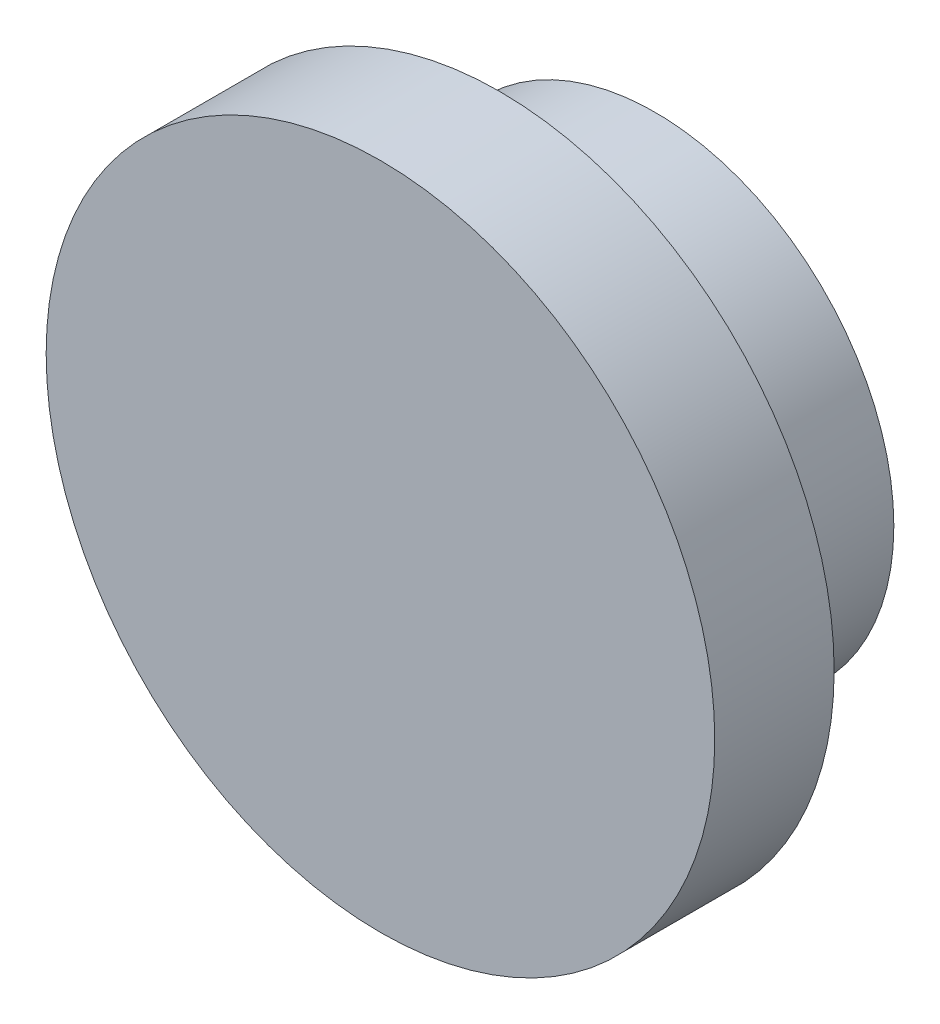
ISO-10303-21;
HEADER;
FILE_DESCRIPTION(('STEP AP214'),'2;1');
FILE_NAME('part.step','',(''),(''),'','','');
FILE_SCHEMA(('AUTOMOTIVE_DESIGN { 1 0 10303 214 1 1 1 1 }'));
ENDSEC;
DATA;
#1=APPLICATION_CONTEXT('core data for automotive mechanical design processes');
#2=APPLICATION_PROTOCOL_DEFINITION('international standard','automotive_design',2000,#1);
#3=PRODUCT_CONTEXT('',#1,'mechanical');
#4=PRODUCT('Part','Part','',(#3));
#5=PRODUCT_RELATED_PRODUCT_CATEGORY('part','',(#4));
#6=PRODUCT_DEFINITION_FORMATION('','',#4);
#7=PRODUCT_DEFINITION_CONTEXT('part definition',#1,'design');
#8=PRODUCT_DEFINITION('design','',#6,#7);
#9=PRODUCT_DEFINITION_SHAPE('','',#8);
#10=(LENGTH_UNIT() NAMED_UNIT(*) SI_UNIT(.MILLI.,.METRE.));
#11=(NAMED_UNIT(*) PLANE_ANGLE_UNIT() SI_UNIT($,.RADIAN.));
#12=(NAMED_UNIT(*) SI_UNIT($,.STERADIAN.) SOLID_ANGLE_UNIT());
#13=UNCERTAINTY_MEASURE_WITH_UNIT(LENGTH_MEASURE(1.E-05),#10,'distance_accuracy_value','');
#14=(GEOMETRIC_REPRESENTATION_CONTEXT(3) GLOBAL_UNCERTAINTY_ASSIGNED_CONTEXT((#13)) GLOBAL_UNIT_ASSIGNED_CONTEXT((#10,
#11,#12)) REPRESENTATION_CONTEXT('',''));
#15=CARTESIAN_POINT('',(0.,0.,0.));
#16=DIRECTION('',(0.,0.,1.));
#17=DIRECTION('',(1.,0.,0.));
#18=AXIS2_PLACEMENT_3D('',#15,#16,#17);
#19=CARTESIAN_POINT('',(0.,0.,6.5));
#20=DIRECTION('',(0.,0.,-1.));
#21=DIRECTION('',(-1.,0.,0.));
#22=AXIS2_PLACEMENT_3D('',#19,#20,#21);
#23=CYLINDRICAL_SURFACE('',#22,10.);
#24=CARTESIAN_POINT('',(0.,0.,6.5));
#25=DIRECTION('',(0.,0.,1.));
#26=DIRECTION('',(1.,0.,0.));
#27=AXIS2_PLACEMENT_3D('',#24,#25,#26);
#28=CIRCLE('',#27,10.);
#29=CARTESIAN_POINT('',(-10.,0.,6.5));
#30=VERTEX_POINT('',#29);
#31=EDGE_CURVE('E10',#30,#30,#28,.T.);
#32=CARTESIAN_POINT('',(0.,0.,0.));
#33=DIRECTION('',(0.,0.,1.));
#34=DIRECTION('',(1.,0.,0.));
#35=AXIS2_PLACEMENT_3D('',#32,#33,#34);
#36=CIRCLE('',#35,10.);
#37=CARTESIAN_POINT('',(-10.,0.,0.));
#38=VERTEX_POINT('',#37);
#39=EDGE_CURVE('E44',#38,#38,#36,.T.);
#40=CARTESIAN_POINT('',(-10.,0.,6.5));
#41=CARTESIAN_POINT('',(-10.,0.,6.43229166666667));
#42=CARTESIAN_POINT('',(-10.,0.,6.36458333333333));
#43=CARTESIAN_POINT('',(-10.,0.,6.22916666666667));
#44=CARTESIAN_POINT('',(-10.,0.,6.16145833333333));
#45=CARTESIAN_POINT('',(-10.,0.,6.02604166666667));
#46=CARTESIAN_POINT('',(-10.,0.,5.95833333333333));
#47=CARTESIAN_POINT('',(-10.,0.,5.82291666666667));
#48=CARTESIAN_POINT('',(-10.,0.,5.75520833333333));
#49=CARTESIAN_POINT('',(-10.,0.,5.61979166666667));
#50=CARTESIAN_POINT('',(-10.,0.,5.55208333333333));
#51=CARTESIAN_POINT('',(-10.,0.,5.41666666666667));
#52=CARTESIAN_POINT('',(-10.,0.,5.34895833333333));
#53=CARTESIAN_POINT('',(-10.,0.,5.21354166666667));
#54=CARTESIAN_POINT('',(-10.,0.,5.14583333333333));
#55=CARTESIAN_POINT('',(-10.,0.,5.01041666666667));
#56=CARTESIAN_POINT('',(-10.,0.,4.94270833333333));
#57=CARTESIAN_POINT('',(-10.,0.,4.80729166666667));
#58=CARTESIAN_POINT('',(-10.,0.,4.73958333333333));
#59=CARTESIAN_POINT('',(-10.,0.,4.60416666666667));
#60=CARTESIAN_POINT('',(-10.,0.,4.53645833333333));
#61=CARTESIAN_POINT('',(-10.,0.,4.40104166666667));
#62=CARTESIAN_POINT('',(-10.,0.,4.33333333333333));
#63=CARTESIAN_POINT('',(-10.,0.,4.19791666666667));
#64=CARTESIAN_POINT('',(-10.,0.,4.13020833333333));
#65=CARTESIAN_POINT('',(-10.,0.,3.99479166666667));
#66=CARTESIAN_POINT('',(-10.,0.,3.92708333333333));
#67=CARTESIAN_POINT('',(-10.,0.,3.79166666666667));
#68=CARTESIAN_POINT('',(-10.,0.,3.72395833333333));
#69=CARTESIAN_POINT('',(-10.,0.,3.58854166666667));
#70=CARTESIAN_POINT('',(-10.,0.,3.52083333333333));
#71=CARTESIAN_POINT('',(-10.,0.,3.38541666666667));
#72=CARTESIAN_POINT('',(-10.,0.,3.31770833333333));
#73=CARTESIAN_POINT('',(-10.,0.,3.18229166666667));
#74=CARTESIAN_POINT('',(-10.,0.,3.11458333333333));
#75=CARTESIAN_POINT('',(-10.,0.,2.97916666666667));
#76=CARTESIAN_POINT('',(-10.,0.,2.91145833333333));
#77=CARTESIAN_POINT('',(-10.,0.,2.77604166666667));
#78=CARTESIAN_POINT('',(-10.,0.,2.70833333333333));
#79=CARTESIAN_POINT('',(-10.,0.,2.57291666666667));
#80=CARTESIAN_POINT('',(-10.,0.,2.50520833333333));
#81=CARTESIAN_POINT('',(-10.,0.,2.36979166666667));
#82=CARTESIAN_POINT('',(-10.,0.,2.30208333333333));
#83=CARTESIAN_POINT('',(-10.,0.,2.16666666666667));
#84=CARTESIAN_POINT('',(-10.,0.,2.09895833333333));
#85=CARTESIAN_POINT('',(-10.,0.,1.96354166666667));
#86=CARTESIAN_POINT('',(-10.,0.,1.89583333333333));
#87=CARTESIAN_POINT('',(-10.,0.,1.76041666666667));
#88=CARTESIAN_POINT('',(-10.,0.,1.69270833333333));
#89=CARTESIAN_POINT('',(-10.,0.,1.55729166666667));
#90=CARTESIAN_POINT('',(-10.,0.,1.48958333333333));
#91=CARTESIAN_POINT('',(-10.,0.,1.35416666666667));
#92=CARTESIAN_POINT('',(-10.,0.,1.28645833333333));
#93=CARTESIAN_POINT('',(-10.,0.,1.15104166666667));
#94=CARTESIAN_POINT('',(-10.,0.,1.08333333333333));
#95=CARTESIAN_POINT('',(-10.,0.,0.947916666666667));
#96=CARTESIAN_POINT('',(-10.,0.,0.880208333333333));
#97=CARTESIAN_POINT('',(-10.,0.,0.744791666666667));
#98=CARTESIAN_POINT('',(-10.,0.,0.677083333333333));
#99=CARTESIAN_POINT('',(-10.,0.,0.541666666666667));
#100=CARTESIAN_POINT('',(-10.,0.,0.473958333333333));
#101=CARTESIAN_POINT('',(-10.,0.,0.338541666666667));
#102=CARTESIAN_POINT('',(-10.,0.,0.270833333333334));
#103=CARTESIAN_POINT('',(-10.,0.,0.135416666666667));
#104=CARTESIAN_POINT('',(-10.,0.,0.0677083333333334));
#105=CARTESIAN_POINT('',(-10.,0.,0.));
#106=B_SPLINE_CURVE_WITH_KNOTS('',3,(#40,#41,#42,#43,#44,#45,#46,#47,#48,#49,#50,#51,#52,#53,
#54,#55,#56,#57,#58,#59,#60,#61,#62,#63,#64,#65,#66,#67,#68,#69,#70,#71,#72,#73,#74,#75,#76,#77,
#78,#79,#80,#81,#82,#83,#84,#85,#86,#87,#88,#89,#90,#91,#92,#93,#94,#95,#96,#97,#98,#99,#100,
#101,#102,#103,#104,#105),.UNSPECIFIED.,.F.,.F.,(4,2,2,2,2,2,2,2,2,2,2,2,2,2,2,2,2,2,2,2,2,2,2,
2,2,2,2,2,2,2,2,2,4),(0.,0.203125,0.40625,0.609375000000001,0.812500000000001,1.015625,1.21875,
1.421875,1.625,1.828125,2.03125,2.234375,2.4375,2.640625,2.84375,3.046875,3.25,3.453125,3.65625,
3.859375,4.0625,4.265625,4.46875,4.671875,4.875,5.078125,5.28125,5.484375,5.6875,5.890625,
6.09375,6.296875,6.5),.UNSPECIFIED.);
#107=EDGE_CURVE('BSEAM41',#30,#38,#106,.T.);
#108=ORIENTED_EDGE('',*,*,#31,.F.);
#109=ORIENTED_EDGE('',*,*,#39,.T.);
#110=ORIENTED_EDGE('',*,*,#107,.T.);
#111=ORIENTED_EDGE('',*,*,#107,.F.);
#112=EDGE_LOOP('',(#108,#110,#109,#111));
#113=FACE_BOUND('',#112,.T.);
#114=ADVANCED_FACE('F41',(#113),#23,.T.);
#115=CARTESIAN_POINT('',(0.,0.,0.));
#116=DIRECTION('',(0.,0.,1.));
#117=DIRECTION('',(1.,0.,0.));
#118=AXIS2_PLACEMENT_3D('',#115,#116,#117);
#119=PLANE('',#118);
#120=ORIENTED_EDGE('',*,*,#39,.F.);
#121=EDGE_LOOP('',(#120));
#122=FACE_BOUND('',#121,.T.);
#123=ADVANCED_FACE('F68',(#122),#119,.F.);
#124=CARTESIAN_POINT('',(0.,0.,11.5));
#125=DIRECTION('',(0.,0.,-1.));
#126=DIRECTION('',(-1.,0.,0.));
#127=AXIS2_PLACEMENT_3D('',#124,#125,#126);
#128=CYLINDRICAL_SURFACE('',#127,14.);
#129=CARTESIAN_POINT('',(0.,0.,11.5));
#130=DIRECTION('',(0.,0.,1.));
#131=DIRECTION('',(1.,0.,0.));
#132=AXIS2_PLACEMENT_3D('',#129,#130,#131);
#133=CIRCLE('',#132,14.);
#134=CARTESIAN_POINT('',(14.,0.,11.5));
#135=VERTEX_POINT('',#134);
#136=EDGE_CURVE('E53',#135,#135,#133,.T.);
#137=ORIENTED_EDGE('',*,*,#136,.F.);
#138=EDGE_LOOP('',(#137));
#139=FACE_BOUND('',#138,.T.);
#140=CARTESIAN_POINT('',(0.,0.,6.5));
#141=DIRECTION('',(0.,0.,1.));
#142=DIRECTION('',(1.,0.,0.));
#143=AXIS2_PLACEMENT_3D('',#140,#141,#142);
#144=CIRCLE('',#143,14.);
#145=CARTESIAN_POINT('',(14.,0.,6.5));
#146=VERTEX_POINT('',#145);
#147=EDGE_CURVE('E55',#146,#146,#144,.T.);
#148=ORIENTED_EDGE('',*,*,#147,.T.);
#149=EDGE_LOOP('',(#148));
#150=FACE_BOUND('',#149,.T.);
#151=ADVANCED_FACE('F65',(#139,#150),#128,.T.);
#152=CARTESIAN_POINT('',(0.,0.,11.5));
#153=DIRECTION('',(0.,0.,1.));
#154=DIRECTION('',(1.,0.,0.));
#155=AXIS2_PLACEMENT_3D('',#152,#153,#154);
#156=PLANE('',#155);
#157=ORIENTED_EDGE('',*,*,#136,.T.);
#158=EDGE_LOOP('',(#157));
#159=FACE_BOUND('',#158,.T.);
#160=ADVANCED_FACE('F63',(#159),#156,.T.);
#161=CARTESIAN_POINT('',(0.,0.,6.5));
#162=DIRECTION('',(0.,0.,1.));
#163=DIRECTION('',(1.,0.,0.));
#164=AXIS2_PLACEMENT_3D('',#161,#162,#163);
#165=PLANE('',#164);
#166=ORIENTED_EDGE('',*,*,#31,.T.);
#167=EDGE_LOOP('',(#166));
#168=FACE_BOUND('',#167,.T.);
#169=ORIENTED_EDGE('',*,*,#147,.F.);
#170=EDGE_LOOP('',(#169));
#171=FACE_BOUND('',#170,.T.);
#172=ADVANCED_FACE('F72',(#168,#171),#165,.F.);
#173=CLOSED_SHELL('',(#114,#123,#151,#160,#172));
#174=MANIFOLD_SOLID_BREP('B2',#173);
#175=ADVANCED_BREP_SHAPE_REPRESENTATION('',(#18,#174),#14);
#176=SHAPE_DEFINITION_REPRESENTATION(#9,#175);
ENDSEC;
END-ISO-10303-21;
